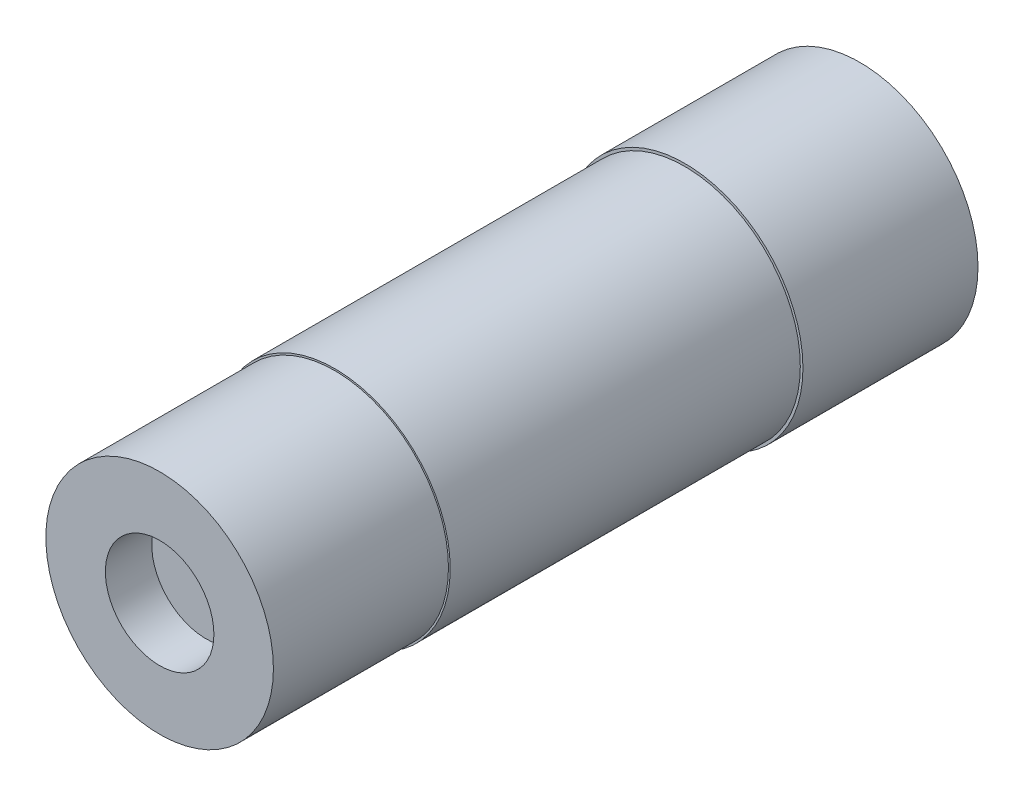
ISO-10303-21;
HEADER;
FILE_DESCRIPTION(('STEP AP214'),'2;1');
FILE_NAME('part.step','',(''),(''),'','','');
FILE_SCHEMA(('AUTOMOTIVE_DESIGN { 1 0 10303 214 1 1 1 1 }'));
ENDSEC;
DATA;
#1=APPLICATION_CONTEXT('core data for automotive mechanical design processes');
#2=APPLICATION_PROTOCOL_DEFINITION('international standard','automotive_design',2000,#1);
#3=PRODUCT_CONTEXT('',#1,'mechanical');
#4=PRODUCT('Part','Part','',(#3));
#5=PRODUCT_RELATED_PRODUCT_CATEGORY('part','',(#4));
#6=PRODUCT_DEFINITION_FORMATION('','',#4);
#7=PRODUCT_DEFINITION_CONTEXT('part definition',#1,'design');
#8=PRODUCT_DEFINITION('design','',#6,#7);
#9=PRODUCT_DEFINITION_SHAPE('','',#8);
#10=(LENGTH_UNIT() NAMED_UNIT(*) SI_UNIT(.MILLI.,.METRE.));
#11=(NAMED_UNIT(*) PLANE_ANGLE_UNIT() SI_UNIT($,.RADIAN.));
#12=(NAMED_UNIT(*) SI_UNIT($,.STERADIAN.) SOLID_ANGLE_UNIT());
#13=UNCERTAINTY_MEASURE_WITH_UNIT(LENGTH_MEASURE(1.E-05),#10,'distance_accuracy_value','');
#14=(GEOMETRIC_REPRESENTATION_CONTEXT(3) GLOBAL_UNCERTAINTY_ASSIGNED_CONTEXT((#13)) GLOBAL_UNIT_ASSIGNED_CONTEXT((#10,
#11,#12)) REPRESENTATION_CONTEXT('',''));
#15=CARTESIAN_POINT('',(0.,0.,0.));
#16=DIRECTION('',(0.,0.,1.));
#17=DIRECTION('',(1.,0.,0.));
#18=AXIS2_PLACEMENT_3D('',#15,#16,#17);
#19=CARTESIAN_POINT('',(0.,0.,40.));
#20=DIRECTION('',(0.,0.,-1.));
#21=DIRECTION('',(-1.,0.,0.));
#22=AXIS2_PLACEMENT_3D('',#19,#20,#21);
#23=CYLINDRICAL_SURFACE('',#22,6.6);
#24=CARTESIAN_POINT('',(0.,0.,10.));
#25=DIRECTION('',(0.,0.,1.));
#26=DIRECTION('',(1.,0.,0.));
#27=AXIS2_PLACEMENT_3D('',#24,#25,#26);
#28=CIRCLE('',#27,6.6);
#29=CARTESIAN_POINT('',(6.6,0.,10.));
#30=VERTEX_POINT('',#29);
#31=EDGE_CURVE('E10',#30,#30,#28,.T.);
#32=ORIENTED_EDGE('',*,*,#31,.T.);
#33=EDGE_LOOP('',(#32));
#34=FACE_BOUND('',#33,.T.);
#35=CARTESIAN_POINT('',(0.,0.,30.));
#36=DIRECTION('',(0.,0.,1.));
#37=DIRECTION('',(1.,0.,0.));
#38=AXIS2_PLACEMENT_3D('',#35,#36,#37);
#39=CIRCLE('',#38,6.6);
#40=CARTESIAN_POINT('',(6.6,0.,30.));
#41=VERTEX_POINT('',#40);
#42=EDGE_CURVE('E56',#41,#41,#39,.T.);
#43=ORIENTED_EDGE('',*,*,#42,.F.);
#44=EDGE_LOOP('',(#43));
#45=FACE_BOUND('',#44,.T.);
#46=ADVANCED_FACE('F35',(#34,#45),#23,.T.);
#47=CARTESIAN_POINT('',(0.,0.,10.));
#48=DIRECTION('',(0.,0.,1.));
#49=DIRECTION('',(1.,0.,0.));
#50=AXIS2_PLACEMENT_3D('',#47,#48,#49);
#51=PLANE('',#50);
#52=ORIENTED_EDGE('',*,*,#31,.F.);
#53=EDGE_LOOP('',(#52));
#54=FACE_BOUND('',#53,.T.);
#55=CARTESIAN_POINT('',(0.,0.,10.));
#56=DIRECTION('',(0.,0.,1.));
#57=DIRECTION('',(1.,0.,0.));
#58=AXIS2_PLACEMENT_3D('',#55,#56,#57);
#59=CIRCLE('',#58,6.75);
#60=CARTESIAN_POINT('',(6.75,0.,10.));
#61=VERTEX_POINT('',#60);
#62=EDGE_CURVE('E43',#61,#61,#59,.T.);
#63=ORIENTED_EDGE('',*,*,#62,.T.);
#64=EDGE_LOOP('',(#63));
#65=FACE_BOUND('',#64,.T.);
#66=ADVANCED_FACE('F66',(#54,#65),#51,.T.);
#67=CARTESIAN_POINT('',(0.,0.,0.));
#68=DIRECTION('',(0.,0.,1.));
#69=DIRECTION('',(1.,0.,0.));
#70=AXIS2_PLACEMENT_3D('',#67,#68,#69);
#71=PLANE('',#70);
#72=CARTESIAN_POINT('',(0.,0.,0.));
#73=DIRECTION('',(0.,0.,1.));
#74=DIRECTION('',(1.,0.,0.));
#75=AXIS2_PLACEMENT_3D('',#72,#73,#74);
#76=CIRCLE('',#75,6.75);
#77=CARTESIAN_POINT('',(6.75,0.,0.));
#78=VERTEX_POINT('',#77);
#79=EDGE_CURVE('E39',#78,#78,#76,.T.);
#80=ORIENTED_EDGE('',*,*,#79,.F.);
#81=EDGE_LOOP('',(#80));
#82=FACE_BOUND('',#81,.T.);
#83=CARTESIAN_POINT('',(0.,0.,0.));
#84=DIRECTION('',(0.,0.,1.));
#85=DIRECTION('',(1.,0.,0.));
#86=AXIS2_PLACEMENT_3D('',#83,#84,#85);
#87=CIRCLE('',#86,2.725);
#88=CARTESIAN_POINT('',(2.725,0.,0.));
#89=VERTEX_POINT('',#88);
#90=EDGE_CURVE('E55',#89,#89,#87,.T.);
#91=ORIENTED_EDGE('',*,*,#90,.T.);
#92=EDGE_LOOP('',(#91));
#93=FACE_BOUND('',#92,.T.);
#94=ADVANCED_FACE('F64',(#82,#93),#71,.F.);
#95=CARTESIAN_POINT('',(0.,0.,10.));
#96=DIRECTION('',(0.,0.,-1.));
#97=DIRECTION('',(-1.,0.,0.));
#98=AXIS2_PLACEMENT_3D('',#95,#96,#97);
#99=CYLINDRICAL_SURFACE('',#98,6.75);
#100=ORIENTED_EDGE('',*,*,#62,.F.);
#101=EDGE_LOOP('',(#100));
#102=FACE_BOUND('',#101,.T.);
#103=ORIENTED_EDGE('',*,*,#79,.T.);
#104=EDGE_LOOP('',(#103));
#105=FACE_BOUND('',#104,.T.);
#106=ADVANCED_FACE('F37',(#102,#105),#99,.T.);
#107=CARTESIAN_POINT('',(0.,0.,10.));
#108=DIRECTION('',(0.,0.,-1.));
#109=DIRECTION('',(-1.,0.,0.));
#110=AXIS2_PLACEMENT_3D('',#107,#108,#109);
#111=CYLINDRICAL_SURFACE('',#110,2.725);
#112=CARTESIAN_POINT('',(0.,0.,10.));
#113=DIRECTION('',(0.,0.,1.));
#114=DIRECTION('',(1.,0.,0.));
#115=AXIS2_PLACEMENT_3D('',#112,#113,#114);
#116=CIRCLE('',#115,2.725);
#117=CARTESIAN_POINT('',(2.725,0.,10.));
#118=VERTEX_POINT('',#117);
#119=EDGE_CURVE('E52',#118,#118,#116,.T.);
#120=ORIENTED_EDGE('',*,*,#119,.T.);
#121=EDGE_LOOP('',(#120));
#122=FACE_BOUND('',#121,.T.);
#123=ORIENTED_EDGE('',*,*,#90,.F.);
#124=EDGE_LOOP('',(#123));
#125=FACE_BOUND('',#124,.T.);
#126=ADVANCED_FACE('F71',(#122,#125),#111,.F.);
#127=CARTESIAN_POINT('',(0.,0.,10.));
#128=DIRECTION('',(0.,0.,1.));
#129=DIRECTION('',(1.,0.,0.));
#130=AXIS2_PLACEMENT_3D('',#127,#128,#129);
#131=PLANE('',#130);
#132=ORIENTED_EDGE('',*,*,#119,.F.);
#133=EDGE_LOOP('',(#132));
#134=FACE_BOUND('',#133,.T.);
#135=ADVANCED_FACE('F82',(#134),#131,.F.);
#136=CARTESIAN_POINT('',(0.,0.,30.));
#137=DIRECTION('',(0.,0.,1.));
#138=DIRECTION('',(1.,0.,0.));
#139=AXIS2_PLACEMENT_3D('',#136,#137,#138);
#140=CYLINDRICAL_SURFACE('',#139,6.5);
#141=CARTESIAN_POINT('',(0.,0.,30.));
#142=DIRECTION('',(0.,0.,1.));
#143=DIRECTION('',(1.,0.,0.));
#144=AXIS2_PLACEMENT_3D('',#141,#142,#143);
#145=CIRCLE('',#144,6.5);
#146=CARTESIAN_POINT('',(6.5,0.,30.));
#147=VERTEX_POINT('',#146);
#148=EDGE_CURVE('E122',#147,#147,#145,.T.);
#149=ORIENTED_EDGE('',*,*,#148,.T.);
#150=EDGE_LOOP('',(#149));
#151=FACE_BOUND('',#150,.T.);
#152=CARTESIAN_POINT('',(0.,0.,40.));
#153=DIRECTION('',(0.,0.,1.));
#154=DIRECTION('',(1.,0.,0.));
#155=AXIS2_PLACEMENT_3D('',#152,#153,#154);
#156=CIRCLE('',#155,6.5);
#157=CARTESIAN_POINT('',(6.5,0.,40.));
#158=VERTEX_POINT('',#157);
#159=EDGE_CURVE('E50',#158,#158,#156,.T.);
#160=ORIENTED_EDGE('',*,*,#159,.F.);
#161=EDGE_LOOP('',(#160));
#162=FACE_BOUND('',#161,.T.);
#163=ADVANCED_FACE('F89',(#151,#162),#140,.T.);
#164=CARTESIAN_POINT('',(0.,0.,30.));
#165=DIRECTION('',(0.,0.,1.));
#166=DIRECTION('',(1.,0.,0.));
#167=AXIS2_PLACEMENT_3D('',#164,#165,#166);
#168=PLANE('',#167);
#169=ORIENTED_EDGE('',*,*,#148,.F.);
#170=EDGE_LOOP('',(#169));
#171=FACE_BOUND('',#170,.T.);
#172=ORIENTED_EDGE('',*,*,#42,.T.);
#173=EDGE_LOOP('',(#172));
#174=FACE_BOUND('',#173,.T.);
#175=ADVANCED_FACE('F96',(#171,#174),#168,.T.);
#176=CARTESIAN_POINT('',(0.,0.,40.));
#177=DIRECTION('',(0.,0.,1.));
#178=DIRECTION('',(1.,0.,0.));
#179=AXIS2_PLACEMENT_3D('',#176,#177,#178);
#180=PLANE('',#179);
#181=CARTESIAN_POINT('',(0.,0.,40.));
#182=DIRECTION('',(0.,0.,1.));
#183=DIRECTION('',(1.,0.,0.));
#184=AXIS2_PLACEMENT_3D('',#181,#182,#183);
#185=CIRCLE('',#184,3.1);
#186=CARTESIAN_POINT('',(3.1,0.,40.));
#187=VERTEX_POINT('',#186);
#188=EDGE_CURVE('E119',#187,#187,#185,.T.);
#189=ORIENTED_EDGE('',*,*,#188,.F.);
#190=EDGE_LOOP('',(#189));
#191=FACE_BOUND('',#190,.T.);
#192=ORIENTED_EDGE('',*,*,#159,.T.);
#193=EDGE_LOOP('',(#192));
#194=FACE_BOUND('',#193,.T.);
#195=ADVANCED_FACE('F102',(#191,#194),#180,.T.);
#196=CARTESIAN_POINT('',(0.,0.,37.35));
#197=DIRECTION('',(0.,0.,1.));
#198=DIRECTION('',(1.,0.,0.));
#199=AXIS2_PLACEMENT_3D('',#196,#197,#198);
#200=CYLINDRICAL_SURFACE('',#199,3.1);
#201=CARTESIAN_POINT('',(0.,0.,37.35));
#202=DIRECTION('',(0.,0.,1.));
#203=DIRECTION('',(1.,0.,0.));
#204=AXIS2_PLACEMENT_3D('',#201,#202,#203);
#205=CIRCLE('',#204,3.1);
#206=CARTESIAN_POINT('',(3.1,0.,37.35));
#207=VERTEX_POINT('',#206);
#208=EDGE_CURVE('E123',#207,#207,#205,.T.);
#209=ORIENTED_EDGE('',*,*,#208,.F.);
#210=EDGE_LOOP('',(#209));
#211=FACE_BOUND('',#210,.T.);
#212=ORIENTED_EDGE('',*,*,#188,.T.);
#213=EDGE_LOOP('',(#212));
#214=FACE_BOUND('',#213,.T.);
#215=ADVANCED_FACE('F109',(#211,#214),#200,.F.);
#216=CARTESIAN_POINT('',(0.,0.,37.35));
#217=DIRECTION('',(0.,0.,1.));
#218=DIRECTION('',(1.,0.,0.));
#219=AXIS2_PLACEMENT_3D('',#216,#217,#218);
#220=PLANE('',#219);
#221=ORIENTED_EDGE('',*,*,#208,.T.);
#222=EDGE_LOOP('',(#221));
#223=FACE_BOUND('',#222,.T.);
#224=ADVANCED_FACE('F114',(#223),#220,.T.);
#225=CLOSED_SHELL('',(#46,#66,#94,#106,#126,#135,#163,#175,#195,#215,#224));
#226=MANIFOLD_SOLID_BREP('B2',#225);
#227=ADVANCED_BREP_SHAPE_REPRESENTATION('',(#18,#226),#14);
#228=SHAPE_DEFINITION_REPRESENTATION(#9,#227);
ENDSEC;
END-ISO-10303-21;
